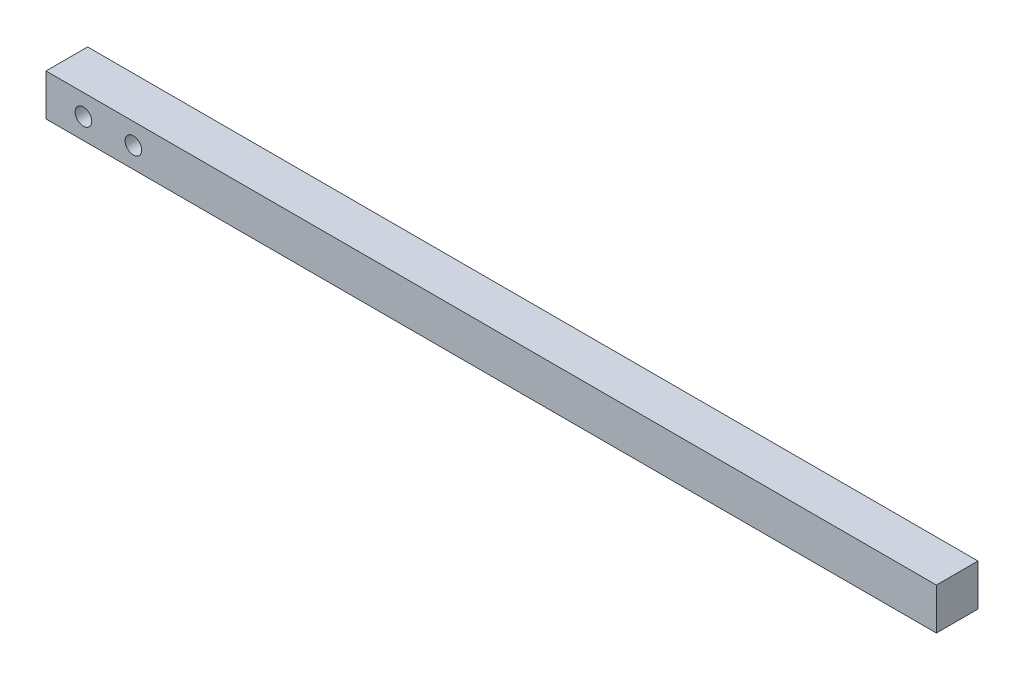
ISO-10303-21;
HEADER;
FILE_DESCRIPTION(('STEP AP214'),'2;1');
FILE_NAME('part.step','',(''),(''),'','','');
FILE_SCHEMA(('AUTOMOTIVE_DESIGN { 1 0 10303 214 1 1 1 1 }'));
ENDSEC;
DATA;
#1=APPLICATION_CONTEXT('core data for automotive mechanical design processes');
#2=APPLICATION_PROTOCOL_DEFINITION('international standard','automotive_design',2000,#1);
#3=PRODUCT_CONTEXT('',#1,'mechanical');
#4=PRODUCT('Part','Part','',(#3));
#5=PRODUCT_RELATED_PRODUCT_CATEGORY('part','',(#4));
#6=PRODUCT_DEFINITION_FORMATION('','',#4);
#7=PRODUCT_DEFINITION_CONTEXT('part definition',#1,'design');
#8=PRODUCT_DEFINITION('design','',#6,#7);
#9=PRODUCT_DEFINITION_SHAPE('','',#8);
#10=(LENGTH_UNIT() NAMED_UNIT(*) SI_UNIT(.MILLI.,.METRE.));
#11=(NAMED_UNIT(*) PLANE_ANGLE_UNIT() SI_UNIT($,.RADIAN.));
#12=(NAMED_UNIT(*) SI_UNIT($,.STERADIAN.) SOLID_ANGLE_UNIT());
#13=UNCERTAINTY_MEASURE_WITH_UNIT(LENGTH_MEASURE(1.E-05),#10,'distance_accuracy_value','');
#14=(GEOMETRIC_REPRESENTATION_CONTEXT(3) GLOBAL_UNCERTAINTY_ASSIGNED_CONTEXT((#13)) GLOBAL_UNIT_ASSIGNED_CONTEXT((#10,
#11,#12)) REPRESENTATION_CONTEXT('',''));
#15=CARTESIAN_POINT('',(0.,0.,0.));
#16=DIRECTION('',(0.,0.,1.));
#17=DIRECTION('',(1.,0.,0.));
#18=AXIS2_PLACEMENT_3D('',#15,#16,#17);
#19=CARTESIAN_POINT('',(214.,5.,-5.));
#20=DIRECTION('',(0.,0.,1.));
#21=DIRECTION('',(0.,-1.,0.));
#22=AXIS2_PLACEMENT_3D('',#19,#20,#21);
#23=PLANE('',#22);
#24=CARTESIAN_POINT('',(21.,0.,-5.));
#25=DIRECTION('',(0.,0.,1.));
#26=DIRECTION('',(1.,0.,0.));
#27=AXIS2_PLACEMENT_3D('',#24,#25,#26);
#28=CIRCLE('',#27,2.);
#29=CARTESIAN_POINT('',(23.,0.,-5.));
#30=VERTEX_POINT('',#29);
#31=EDGE_CURVE('E111',#30,#30,#28,.T.);
#32=ORIENTED_EDGE('',*,*,#31,.T.);
#33=EDGE_LOOP('',(#32));
#34=FACE_BOUND('',#33,.T.);
#35=CARTESIAN_POINT('',(9.,0.,-5.));
#36=DIRECTION('',(0.,0.,1.));
#37=DIRECTION('',(1.,0.,0.));
#38=AXIS2_PLACEMENT_3D('',#35,#36,#37);
#39=CIRCLE('',#38,2.);
#40=CARTESIAN_POINT('',(11.,0.,-5.));
#41=VERTEX_POINT('',#40);
#42=EDGE_CURVE('E97',#41,#41,#39,.T.);
#43=ORIENTED_EDGE('',*,*,#42,.T.);
#44=EDGE_LOOP('',(#43));
#45=FACE_BOUND('',#44,.T.);
#46=DIRECTION('',(0.,1.,0.));
#47=VECTOR('',#46,1.);
#48=CARTESIAN_POINT('',(0.,5.,-5.));
#49=LINE('',#48,#47);
#50=CARTESIAN_POINT('',(0.,-5.,-5.));
#51=VERTEX_POINT('',#50);
#52=CARTESIAN_POINT('',(0.,5.,-5.));
#53=VERTEX_POINT('',#52);
#54=EDGE_CURVE('E94',#51,#53,#49,.T.);
#55=ORIENTED_EDGE('',*,*,#54,.T.);
#56=DIRECTION('',(-1.,0.,0.));
#57=VECTOR('',#56,1.);
#58=CARTESIAN_POINT('',(214.,5.,-5.));
#59=LINE('',#58,#57);
#60=CARTESIAN_POINT('',(214.,5.,-5.));
#61=VERTEX_POINT('',#60);
#62=EDGE_CURVE('E11',#61,#53,#59,.T.);
#63=ORIENTED_EDGE('',*,*,#62,.F.);
#64=DIRECTION('',(0.,1.,0.));
#65=VECTOR('',#64,1.);
#66=CARTESIAN_POINT('',(214.,5.,-5.));
#67=LINE('',#66,#65);
#68=CARTESIAN_POINT('',(214.,-5.,-5.));
#69=VERTEX_POINT('',#68);
#70=EDGE_CURVE('E82',#69,#61,#67,.T.);
#71=ORIENTED_EDGE('',*,*,#70,.F.);
#72=DIRECTION('',(-1.,0.,0.));
#73=VECTOR('',#72,1.);
#74=CARTESIAN_POINT('',(214.,-5.,-5.));
#75=LINE('',#74,#73);
#76=EDGE_CURVE('E90',#69,#51,#75,.T.);
#77=ORIENTED_EDGE('',*,*,#76,.T.);
#78=EDGE_LOOP('',(#55,#63,#71,#77));
#79=FACE_BOUND('',#78,.T.);
#80=ADVANCED_FACE('F31',(#34,#45,#79),#23,.F.);
#81=CARTESIAN_POINT('',(214.,5.,5.));
#82=DIRECTION('',(0.,-1.,0.));
#83=DIRECTION('',(0.,0.,-1.));
#84=AXIS2_PLACEMENT_3D('',#81,#82,#83);
#85=PLANE('',#84);
#86=DIRECTION('',(0.,0.,1.));
#87=VECTOR('',#86,1.);
#88=CARTESIAN_POINT('',(0.,5.,5.));
#89=LINE('',#88,#87);
#90=CARTESIAN_POINT('',(0.,5.,5.));
#91=VERTEX_POINT('',#90);
#92=EDGE_CURVE('E86',#53,#91,#89,.T.);
#93=ORIENTED_EDGE('',*,*,#92,.T.);
#94=DIRECTION('',(-1.,0.,0.));
#95=VECTOR('',#94,1.);
#96=CARTESIAN_POINT('',(214.,5.,5.));
#97=LINE('',#96,#95);
#98=CARTESIAN_POINT('',(214.,5.,5.));
#99=VERTEX_POINT('',#98);
#100=EDGE_CURVE('E39',#99,#91,#97,.T.);
#101=ORIENTED_EDGE('',*,*,#100,.F.);
#102=DIRECTION('',(0.,0.,1.));
#103=VECTOR('',#102,1.);
#104=CARTESIAN_POINT('',(214.,5.,5.));
#105=LINE('',#104,#103);
#106=EDGE_CURVE('E77',#61,#99,#105,.T.);
#107=ORIENTED_EDGE('',*,*,#106,.F.);
#108=ORIENTED_EDGE('',*,*,#62,.T.);
#109=EDGE_LOOP('',(#93,#101,#107,#108));
#110=FACE_BOUND('',#109,.T.);
#111=ADVANCED_FACE('F85',(#110),#85,.F.);
#112=CARTESIAN_POINT('',(214.,5.,5.));
#113=DIRECTION('',(0.,0.,-1.));
#114=DIRECTION('',(0.,1.,0.));
#115=AXIS2_PLACEMENT_3D('',#112,#113,#114);
#116=PLANE('',#115);
#117=CARTESIAN_POINT('',(21.,0.,5.));
#118=DIRECTION('',(0.,0.,1.));
#119=DIRECTION('',(1.,0.,0.));
#120=AXIS2_PLACEMENT_3D('',#117,#118,#119);
#121=CIRCLE('',#120,2.);
#122=CARTESIAN_POINT('',(23.,0.,5.));
#123=VERTEX_POINT('',#122);
#124=EDGE_CURVE('E114',#123,#123,#121,.T.);
#125=ORIENTED_EDGE('',*,*,#124,.F.);
#126=EDGE_LOOP('',(#125));
#127=FACE_BOUND('',#126,.T.);
#128=CARTESIAN_POINT('',(9.,0.,5.));
#129=DIRECTION('',(0.,0.,1.));
#130=DIRECTION('',(1.,0.,0.));
#131=AXIS2_PLACEMENT_3D('',#128,#129,#130);
#132=CIRCLE('',#131,2.);
#133=CARTESIAN_POINT('',(11.,0.,5.));
#134=VERTEX_POINT('',#133);
#135=EDGE_CURVE('E108',#134,#134,#132,.T.);
#136=ORIENTED_EDGE('',*,*,#135,.F.);
#137=EDGE_LOOP('',(#136));
#138=FACE_BOUND('',#137,.T.);
#139=DIRECTION('',(0.,-1.,0.));
#140=VECTOR('',#139,1.);
#141=CARTESIAN_POINT('',(0.,5.,5.));
#142=LINE('',#141,#140);
#143=CARTESIAN_POINT('',(0.,-5.,5.));
#144=VERTEX_POINT('',#143);
#145=EDGE_CURVE('E64',#91,#144,#142,.T.);
#146=ORIENTED_EDGE('',*,*,#145,.T.);
#147=DIRECTION('',(-1.,0.,0.));
#148=VECTOR('',#147,1.);
#149=CARTESIAN_POINT('',(214.,-5.,5.));
#150=LINE('',#149,#148);
#151=CARTESIAN_POINT('',(214.,-5.,5.));
#152=VERTEX_POINT('',#151);
#153=EDGE_CURVE('E87',#152,#144,#150,.T.);
#154=ORIENTED_EDGE('',*,*,#153,.F.);
#155=DIRECTION('',(0.,-1.,0.));
#156=VECTOR('',#155,1.);
#157=CARTESIAN_POINT('',(214.,5.,5.));
#158=LINE('',#157,#156);
#159=EDGE_CURVE('E80',#99,#152,#158,.T.);
#160=ORIENTED_EDGE('',*,*,#159,.F.);
#161=ORIENTED_EDGE('',*,*,#100,.T.);
#162=EDGE_LOOP('',(#146,#154,#160,#161));
#163=FACE_BOUND('',#162,.T.);
#164=ADVANCED_FACE('F88',(#127,#138,#163),#116,.F.);
#165=CARTESIAN_POINT('',(214.,-5.,5.));
#166=DIRECTION('',(0.,1.,0.));
#167=DIRECTION('',(0.,0.,1.));
#168=AXIS2_PLACEMENT_3D('',#165,#166,#167);
#169=PLANE('',#168);
#170=DIRECTION('',(0.,0.,-1.));
#171=VECTOR('',#170,1.);
#172=CARTESIAN_POINT('',(0.,-5.,5.));
#173=LINE('',#172,#171);
#174=EDGE_CURVE('E70',#144,#51,#173,.T.);
#175=ORIENTED_EDGE('',*,*,#174,.T.);
#176=ORIENTED_EDGE('',*,*,#76,.F.);
#177=DIRECTION('',(0.,0.,-1.));
#178=VECTOR('',#177,1.);
#179=CARTESIAN_POINT('',(214.,-5.,5.));
#180=LINE('',#179,#178);
#181=EDGE_CURVE('E47',#152,#69,#180,.T.);
#182=ORIENTED_EDGE('',*,*,#181,.F.);
#183=ORIENTED_EDGE('',*,*,#153,.T.);
#184=EDGE_LOOP('',(#175,#176,#182,#183));
#185=FACE_BOUND('',#184,.T.);
#186=ADVANCED_FACE('F102',(#185),#169,.F.);
#187=CARTESIAN_POINT('',(214.,-5.,-5.));
#188=DIRECTION('',(1.,0.,0.));
#189=DIRECTION('',(0.,0.,-1.));
#190=AXIS2_PLACEMENT_3D('',#187,#188,#189);
#191=PLANE('',#190);
#192=ORIENTED_EDGE('',*,*,#70,.T.);
#193=ORIENTED_EDGE('',*,*,#106,.T.);
#194=ORIENTED_EDGE('',*,*,#159,.T.);
#195=ORIENTED_EDGE('',*,*,#181,.T.);
#196=EDGE_LOOP('',(#192,#193,#194,#195));
#197=FACE_BOUND('',#196,.T.);
#198=ADVANCED_FACE('F78',(#197),#191,.T.);
#199=CARTESIAN_POINT('',(0.,-5.,-5.));
#200=DIRECTION('',(1.,0.,0.));
#201=DIRECTION('',(0.,0.,-1.));
#202=AXIS2_PLACEMENT_3D('',#199,#200,#201);
#203=PLANE('',#202);
#204=ORIENTED_EDGE('',*,*,#54,.F.);
#205=ORIENTED_EDGE('',*,*,#174,.F.);
#206=ORIENTED_EDGE('',*,*,#145,.F.);
#207=ORIENTED_EDGE('',*,*,#92,.F.);
#208=EDGE_LOOP('',(#204,#205,#206,#207));
#209=FACE_BOUND('',#208,.T.);
#210=ADVANCED_FACE('F105',(#209),#203,.F.);
#211=CARTESIAN_POINT('',(9.,0.,-5.));
#212=DIRECTION('',(0.,0.,1.));
#213=DIRECTION('',(1.,0.,0.));
#214=AXIS2_PLACEMENT_3D('',#211,#212,#213);
#215=CYLINDRICAL_SURFACE('',#214,2.);
#216=ORIENTED_EDGE('',*,*,#42,.F.);
#217=EDGE_LOOP('',(#216));
#218=FACE_BOUND('',#217,.T.);
#219=ORIENTED_EDGE('',*,*,#135,.T.);
#220=EDGE_LOOP('',(#219));
#221=FACE_BOUND('',#220,.T.);
#222=ADVANCED_FACE('F125',(#218,#221),#215,.F.);
#223=CARTESIAN_POINT('',(21.,0.,-5.));
#224=DIRECTION('',(0.,0.,1.));
#225=DIRECTION('',(1.,0.,0.));
#226=AXIS2_PLACEMENT_3D('',#223,#224,#225);
#227=CYLINDRICAL_SURFACE('',#226,2.);
#228=ORIENTED_EDGE('',*,*,#31,.F.);
#229=EDGE_LOOP('',(#228));
#230=FACE_BOUND('',#229,.T.);
#231=ORIENTED_EDGE('',*,*,#124,.T.);
#232=EDGE_LOOP('',(#231));
#233=FACE_BOUND('',#232,.T.);
#234=ADVANCED_FACE('F122',(#230,#233),#227,.F.);
#235=CLOSED_SHELL('',(#80,#111,#164,#186,#198,#210,#222,#234));
#236=MANIFOLD_SOLID_BREP('B2',#235);
#237=ADVANCED_BREP_SHAPE_REPRESENTATION('',(#18,#236),#14);
#238=SHAPE_DEFINITION_REPRESENTATION(#9,#237);
ENDSEC;
END-ISO-10303-21;
